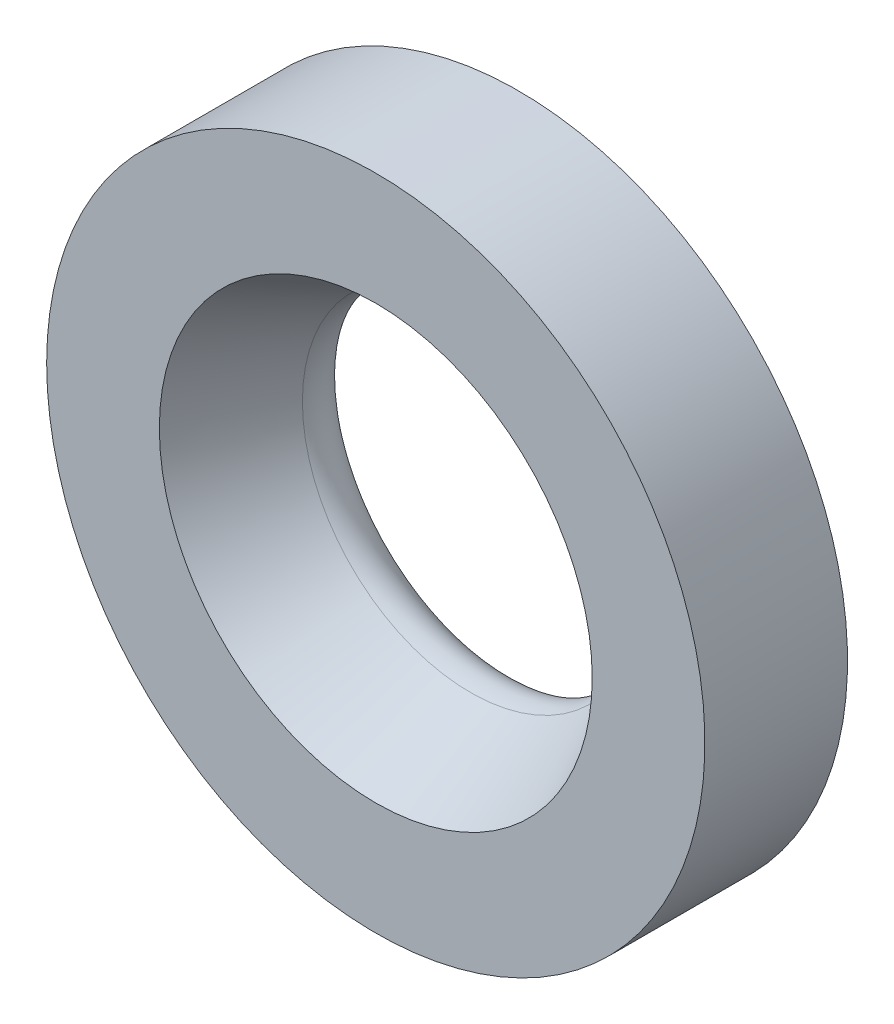
ISO-10303-21;
HEADER;
FILE_DESCRIPTION(('STEP AP214'),'2;1');
FILE_NAME('part.step','',(''),(''),'','','');
FILE_SCHEMA(('AUTOMOTIVE_DESIGN { 1 0 10303 214 1 1 1 1 }'));
ENDSEC;
DATA;
#1=APPLICATION_CONTEXT('core data for automotive mechanical design processes');
#2=APPLICATION_PROTOCOL_DEFINITION('international standard','automotive_design',2000,#1);
#3=PRODUCT_CONTEXT('',#1,'mechanical');
#4=PRODUCT('Part','Part','',(#3));
#5=PRODUCT_RELATED_PRODUCT_CATEGORY('part','',(#4));
#6=PRODUCT_DEFINITION_FORMATION('','',#4);
#7=PRODUCT_DEFINITION_CONTEXT('part definition',#1,'design');
#8=PRODUCT_DEFINITION('design','',#6,#7);
#9=PRODUCT_DEFINITION_SHAPE('','',#8);
#10=(LENGTH_UNIT() NAMED_UNIT(*) SI_UNIT(.MILLI.,.METRE.));
#11=(NAMED_UNIT(*) PLANE_ANGLE_UNIT() SI_UNIT($,.RADIAN.));
#12=(NAMED_UNIT(*) SI_UNIT($,.STERADIAN.) SOLID_ANGLE_UNIT());
#13=UNCERTAINTY_MEASURE_WITH_UNIT(LENGTH_MEASURE(1.E-05),#10,'distance_accuracy_value','');
#14=(GEOMETRIC_REPRESENTATION_CONTEXT(3) GLOBAL_UNCERTAINTY_ASSIGNED_CONTEXT((#13)) GLOBAL_UNIT_ASSIGNED_CONTEXT((#10,
#11,#12)) REPRESENTATION_CONTEXT('',''));
#15=CARTESIAN_POINT('',(0.,0.,0.));
#16=DIRECTION('',(0.,0.,1.));
#17=DIRECTION('',(1.,0.,0.));
#18=AXIS2_PLACEMENT_3D('',#15,#16,#17);
#19=CARTESIAN_POINT('',(0.,0.,0.));
#20=DIRECTION('',(0.,0.,-1.));
#21=DIRECTION('',(-1.,0.,0.));
#22=AXIS2_PLACEMENT_3D('',#19,#20,#21);
#23=CYLINDRICAL_SURFACE('',#22,15.);
#24=CARTESIAN_POINT('',(0.,0.,-6.5));
#25=DIRECTION('',(0.,0.,-1.));
#26=DIRECTION('',(-1.,0.,0.));
#27=AXIS2_PLACEMENT_3D('',#24,#25,#26);
#28=CIRCLE('',#27,15.);
#29=CARTESIAN_POINT('',(-15.,0.,-6.5));
#30=VERTEX_POINT('',#29);
#31=EDGE_CURVE('E10',#30,#30,#28,.T.);
#32=ORIENTED_EDGE('',*,*,#31,.F.);
#33=EDGE_LOOP('',(#32));
#34=FACE_BOUND('',#33,.T.);
#35=CARTESIAN_POINT('',(0.,0.,0.));
#36=DIRECTION('',(0.,0.,-1.));
#37=DIRECTION('',(-1.,0.,0.));
#38=AXIS2_PLACEMENT_3D('',#35,#36,#37);
#39=CIRCLE('',#38,15.);
#40=CARTESIAN_POINT('',(-15.,0.,0.));
#41=VERTEX_POINT('',#40);
#42=EDGE_CURVE('E69',#41,#41,#39,.T.);
#43=ORIENTED_EDGE('',*,*,#42,.T.);
#44=EDGE_LOOP('',(#43));
#45=FACE_BOUND('',#44,.T.);
#46=ADVANCED_FACE('F41',(#34,#45),#23,.T.);
#47=CARTESIAN_POINT('',(0.,-15.,-6.5));
#48=DIRECTION('',(0.,0.,1.));
#49=DIRECTION('',(1.,0.,0.));
#50=AXIS2_PLACEMENT_3D('',#47,#48,#49);
#51=PLANE('',#50);
#52=CARTESIAN_POINT('',(0.,0.,-6.5));
#53=DIRECTION('',(0.,0.,-1.));
#54=DIRECTION('',(-1.,0.,0.));
#55=AXIS2_PLACEMENT_3D('',#52,#53,#54);
#56=CIRCLE('',#55,13.5);
#57=CARTESIAN_POINT('',(-13.5,0.,-6.5));
#58=VERTEX_POINT('',#57);
#59=EDGE_CURVE('E47',#58,#58,#56,.T.);
#60=ORIENTED_EDGE('',*,*,#59,.F.);
#61=EDGE_LOOP('',(#60));
#62=FACE_BOUND('',#61,.T.);
#63=ORIENTED_EDGE('',*,*,#31,.T.);
#64=EDGE_LOOP('',(#63));
#65=FACE_BOUND('',#64,.T.);
#66=ADVANCED_FACE('F106',(#62,#65),#51,.F.);
#67=CARTESIAN_POINT('',(0.,0.,0.));
#68=DIRECTION('',(0.,0.,-1.));
#69=DIRECTION('',(-1.,0.,0.));
#70=AXIS2_PLACEMENT_3D('',#67,#68,#69);
#71=CYLINDRICAL_SURFACE('',#70,13.5);
#72=CARTESIAN_POINT('',(0.,0.,-1.5));
#73=DIRECTION('',(0.,0.,-1.));
#74=DIRECTION('',(-1.,0.,0.));
#75=AXIS2_PLACEMENT_3D('',#72,#73,#74);
#76=CIRCLE('',#75,13.5);
#77=CARTESIAN_POINT('',(-13.5,0.,-1.5));
#78=VERTEX_POINT('',#77);
#79=EDGE_CURVE('E51',#78,#78,#76,.T.);
#80=ORIENTED_EDGE('',*,*,#79,.F.);
#81=EDGE_LOOP('',(#80));
#82=FACE_BOUND('',#81,.T.);
#83=ORIENTED_EDGE('',*,*,#59,.T.);
#84=EDGE_LOOP('',(#83));
#85=FACE_BOUND('',#84,.T.);
#86=ADVANCED_FACE('F101',(#82,#85),#71,.F.);
#87=CARTESIAN_POINT('',(0.,-13.5,-1.5));
#88=DIRECTION('',(0.,0.,1.));
#89=DIRECTION('',(1.,0.,0.));
#90=AXIS2_PLACEMENT_3D('',#87,#88,#89);
#91=PLANE('',#90);
#92=CARTESIAN_POINT('',(0.,0.,-1.5));
#93=DIRECTION('',(0.,0.,-1.));
#94=DIRECTION('',(-1.,0.,0.));
#95=AXIS2_PLACEMENT_3D('',#92,#93,#94);
#96=CIRCLE('',#95,10.7833390732305);
#97=CARTESIAN_POINT('',(-10.7833390732305,0.,-1.5));
#98=VERTEX_POINT('',#97);
#99=EDGE_CURVE('E55',#98,#98,#96,.T.);
#100=ORIENTED_EDGE('',*,*,#99,.F.);
#101=EDGE_LOOP('',(#100));
#102=FACE_BOUND('',#101,.T.);
#103=ORIENTED_EDGE('',*,*,#79,.T.);
#104=EDGE_LOOP('',(#103));
#105=FACE_BOUND('',#104,.T.);
#106=ADVANCED_FACE('F95',(#102,#105),#91,.F.);
#107=CARTESIAN_POINT('',(0.,0.,-1.5));
#108=DIRECTION('',(0.,0.,1.));
#109=DIRECTION('',(1.,0.,0.));
#110=AXIS2_PLACEMENT_3D('',#107,#108,#109);
#111=CONICAL_SURFACE('',#110,10.7833390732305,0.471238898038474);
#112=CARTESIAN_POINT('',(0.,0.,-3.66349021371745));
#113=DIRECTION('',(0.,0.,-1.));
#114=DIRECTION('',(-1.,0.,0.));
#115=AXIS2_PLACEMENT_3D('',#112,#113,#114);
#116=CIRCLE('',#115,9.68098574960932);
#117=CARTESIAN_POINT('',(-9.68098574960932,0.,-3.66349021371745));
#118=VERTEX_POINT('',#117);
#119=EDGE_CURVE('E60',#118,#118,#116,.T.);
#120=ORIENTED_EDGE('',*,*,#119,.F.);
#121=EDGE_LOOP('',(#120));
#122=FACE_BOUND('',#121,.T.);
#123=ORIENTED_EDGE('',*,*,#99,.T.);
#124=EDGE_LOOP('',(#123));
#125=FACE_BOUND('',#124,.T.);
#126=ADVANCED_FACE('F89',(#122,#125),#111,.T.);
#127=CARTESIAN_POINT('',(0.,0.,-5.));
#128=DIRECTION('',(0.,0.,-1.));
#129=DIRECTION('',(-1.,0.,0.));
#130=AXIS2_PLACEMENT_3D('',#127,#128,#129);
#131=TOROIDAL_SURFACE('',#130,9.,1.5);
#132=CARTESIAN_POINT('',(0.,0.,-4.31901425039067));
#133=DIRECTION('',(0.,0.,-1.));
#134=DIRECTION('',(-1.,0.,0.));
#135=AXIS2_PLACEMENT_3D('',#132,#133,#134);
#136=CIRCLE('',#135,7.66349021371745);
#137=CARTESIAN_POINT('',(-7.66349021371745,0.,-4.31901425039067));
#138=VERTEX_POINT('',#137);
#139=EDGE_CURVE('E63',#138,#138,#136,.T.);
#140=ORIENTED_EDGE('',*,*,#139,.F.);
#141=EDGE_LOOP('',(#140));
#142=FACE_BOUND('',#141,.T.);
#143=ORIENTED_EDGE('',*,*,#119,.T.);
#144=EDGE_LOOP('',(#143));
#145=FACE_BOUND('',#144,.T.);
#146=ADVANCED_FACE('F83',(#142,#145),#131,.T.);
#147=CARTESIAN_POINT('',(0.,0.,-4.31901425039067));
#148=DIRECTION('',(0.,0.,1.));
#149=DIRECTION('',(1.,0.,0.));
#150=AXIS2_PLACEMENT_3D('',#147,#148,#149);
#151=CONICAL_SURFACE('',#150,7.66349021371745,0.471238898038474);
#152=CARTESIAN_POINT('',(0.,0.,0.));
#153=DIRECTION('',(0.,0.,-1.));
#154=DIRECTION('',(-1.,0.,0.));
#155=AXIS2_PLACEMENT_3D('',#152,#153,#154);
#156=CIRCLE('',#155,9.86413789102063);
#157=CARTESIAN_POINT('',(-9.86413789102063,0.,0.));
#158=VERTEX_POINT('',#157);
#159=EDGE_CURVE('E66',#158,#158,#156,.T.);
#160=ORIENTED_EDGE('',*,*,#159,.F.);
#161=EDGE_LOOP('',(#160));
#162=FACE_BOUND('',#161,.T.);
#163=ORIENTED_EDGE('',*,*,#139,.T.);
#164=EDGE_LOOP('',(#163));
#165=FACE_BOUND('',#164,.T.);
#166=ADVANCED_FACE('F77',(#162,#165),#151,.F.);
#167=CARTESIAN_POINT('',(0.,-15.,0.));
#168=DIRECTION('',(0.,0.,-1.));
#169=DIRECTION('',(-1.,0.,0.));
#170=AXIS2_PLACEMENT_3D('',#167,#168,#169);
#171=PLANE('',#170);
#172=ORIENTED_EDGE('',*,*,#42,.F.);
#173=EDGE_LOOP('',(#172));
#174=FACE_BOUND('',#173,.T.);
#175=ORIENTED_EDGE('',*,*,#159,.T.);
#176=EDGE_LOOP('',(#175));
#177=FACE_BOUND('',#176,.T.);
#178=ADVANCED_FACE('F74',(#174,#177),#171,.F.);
#179=CLOSED_SHELL('',(#46,#66,#86,#106,#126,#146,#166,#178));
#180=MANIFOLD_SOLID_BREP('B2',#179);
#181=ADVANCED_BREP_SHAPE_REPRESENTATION('',(#18,#180),#14);
#182=SHAPE_DEFINITION_REPRESENTATION(#9,#181);
ENDSEC;
END-ISO-10303-21;
